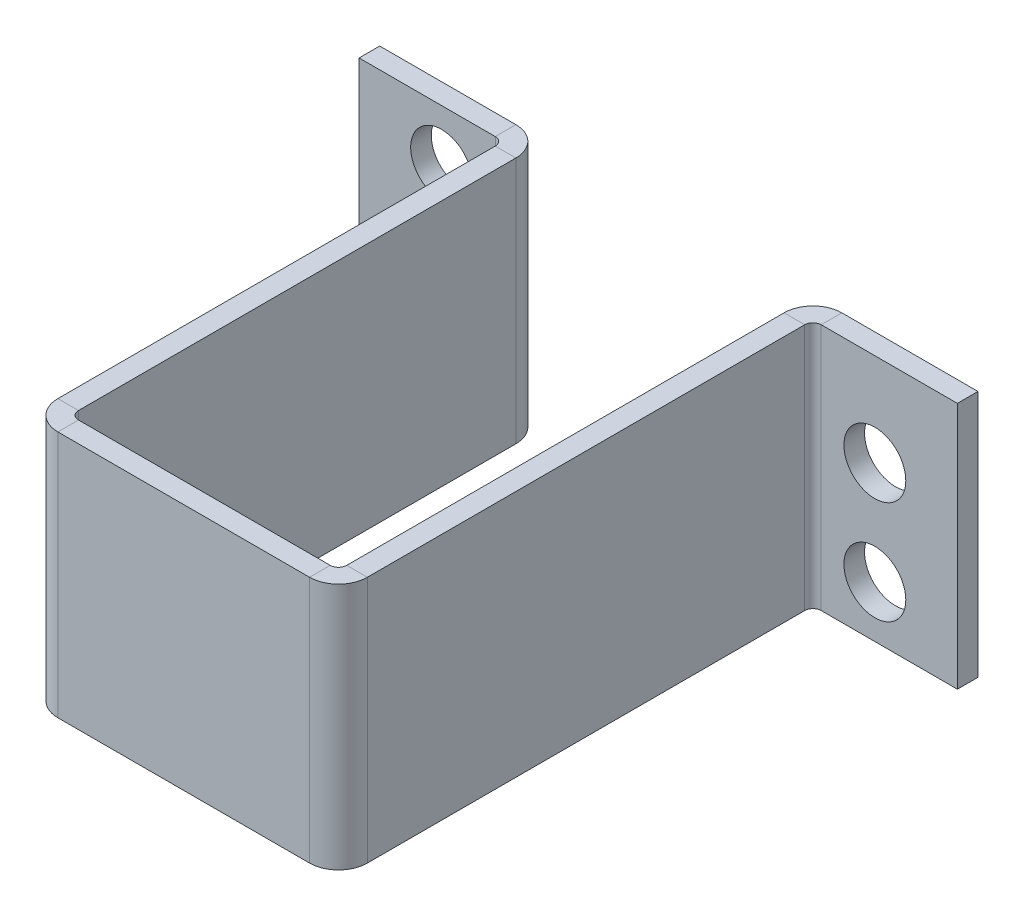
ISO-10303-21;
HEADER;
FILE_DESCRIPTION(('STEP AP214'),'2;1');
FILE_NAME('part.step','',(''),(''),'','','');
FILE_SCHEMA(('AUTOMOTIVE_DESIGN { 1 0 10303 214 1 1 1 1 }'));
ENDSEC;
DATA;
#1=APPLICATION_CONTEXT('core data for automotive mechanical design processes');
#2=APPLICATION_PROTOCOL_DEFINITION('international standard','automotive_design',2000,#1);
#3=PRODUCT_CONTEXT('',#1,'mechanical');
#4=PRODUCT('Part','Part','',(#3));
#5=PRODUCT_RELATED_PRODUCT_CATEGORY('part','',(#4));
#6=PRODUCT_DEFINITION_FORMATION('','',#4);
#7=PRODUCT_DEFINITION_CONTEXT('part definition',#1,'design');
#8=PRODUCT_DEFINITION('design','',#6,#7);
#9=PRODUCT_DEFINITION_SHAPE('','',#8);
#10=(LENGTH_UNIT() NAMED_UNIT(*) SI_UNIT(.MILLI.,.METRE.));
#11=(NAMED_UNIT(*) PLANE_ANGLE_UNIT() SI_UNIT($,.RADIAN.));
#12=(NAMED_UNIT(*) SI_UNIT($,.STERADIAN.) SOLID_ANGLE_UNIT());
#13=UNCERTAINTY_MEASURE_WITH_UNIT(LENGTH_MEASURE(1.E-05),#10,'distance_accuracy_value','');
#14=(GEOMETRIC_REPRESENTATION_CONTEXT(3) GLOBAL_UNCERTAINTY_ASSIGNED_CONTEXT((#13)) GLOBAL_UNIT_ASSIGNED_CONTEXT((#10,
#11,#12)) REPRESENTATION_CONTEXT('',''));
#15=CARTESIAN_POINT('',(0.,0.,0.));
#16=DIRECTION('',(0.,0.,1.));
#17=DIRECTION('',(1.,0.,0.));
#18=AXIS2_PLACEMENT_3D('',#15,#16,#17);
#19=CARTESIAN_POINT('',(3.75000000000004,-3.,-11.5));
#20=DIRECTION('',(0.,1.,0.));
#21=DIRECTION('',(-1.,0.,0.));
#22=AXIS2_PLACEMENT_3D('',#19,#20,#21);
#23=PLANE('',#22);
#24=DIRECTION('',(-1.,0.,0.));
#25=VECTOR('',#24,1.);
#26=CARTESIAN_POINT('',(3.75000000000004,-3.,-11.3));
#27=LINE('',#26,#25);
#28=CARTESIAN_POINT('',(3.75000000000004,-3.,-11.3));
#29=VERTEX_POINT('',#28);
#30=CARTESIAN_POINT('',(3.25000000000004,-3.,-11.3));
#31=VERTEX_POINT('',#30);
#32=EDGE_CURVE('E234',#29,#31,#27,.T.);
#33=ORIENTED_EDGE('',*,*,#32,.F.);
#34=DIRECTION('',(0.,0.,-1.));
#35=VECTOR('',#34,1.);
#36=CARTESIAN_POINT('',(3.75000000000004,-3.,-11.5));
#37=LINE('',#36,#35);
#38=CARTESIAN_POINT('',(3.75,-3.,-0.699999999999998));
#39=VERTEX_POINT('',#38);
#40=EDGE_CURVE('E299',#39,#29,#37,.T.);
#41=ORIENTED_EDGE('',*,*,#40,.F.);
#42=DIRECTION('',(1.,0.,0.));
#43=VECTOR('',#42,1.);
#44=CARTESIAN_POINT('',(3.25,-3.,-0.699999999999999));
#45=LINE('',#44,#43);
#46=CARTESIAN_POINT('',(3.25,-3.,-0.699999999999999));
#47=VERTEX_POINT('',#46);
#48=EDGE_CURVE('E290',#47,#39,#45,.T.);
#49=ORIENTED_EDGE('',*,*,#48,.F.);
#50=DIRECTION('',(0.,0.,-1.));
#51=VECTOR('',#50,1.);
#52=CARTESIAN_POINT('',(3.25000000000004,-3.,-11.5));
#53=LINE('',#52,#51);
#54=EDGE_CURVE('E298',#47,#31,#53,.T.);
#55=ORIENTED_EDGE('',*,*,#54,.T.);
#56=EDGE_LOOP('',(#33,#41,#49,#55));
#57=FACE_BOUND('',#56,.T.);
#58=ADVANCED_FACE('F39',(#57),#23,.F.);
#59=CARTESIAN_POINT('',(3.75,3.,-0.499999999999998));
#60=DIRECTION('',(0.,-1.,0.));
#61=DIRECTION('',(1.,0.,0.));
#62=AXIS2_PLACEMENT_3D('',#59,#60,#61);
#63=PLANE('',#62);
#64=DIRECTION('',(-1.,0.,0.));
#65=VECTOR('',#64,1.);
#66=CARTESIAN_POINT('',(3.75000000000004,3.,-11.3));
#67=LINE('',#66,#65);
#68=CARTESIAN_POINT('',(3.75000000000004,3.,-11.3));
#69=VERTEX_POINT('',#68);
#70=CARTESIAN_POINT('',(3.25000000000004,3.,-11.3));
#71=VERTEX_POINT('',#70);
#72=EDGE_CURVE('E227',#69,#71,#67,.T.);
#73=ORIENTED_EDGE('',*,*,#72,.T.);
#74=DIRECTION('',(0.,0.,1.));
#75=VECTOR('',#74,1.);
#76=CARTESIAN_POINT('',(3.25,3.,-0.5));
#77=LINE('',#76,#75);
#78=CARTESIAN_POINT('',(3.25,3.,-0.699999999999999));
#79=VERTEX_POINT('',#78);
#80=EDGE_CURVE('E303',#71,#79,#77,.T.);
#81=ORIENTED_EDGE('',*,*,#80,.T.);
#82=DIRECTION('',(1.,0.,0.));
#83=VECTOR('',#82,1.);
#84=CARTESIAN_POINT('',(3.25,3.,-0.699999999999999));
#85=LINE('',#84,#83);
#86=CARTESIAN_POINT('',(3.75,3.,-0.699999999999998));
#87=VERTEX_POINT('',#86);
#88=EDGE_CURVE('E285',#79,#87,#85,.T.);
#89=ORIENTED_EDGE('',*,*,#88,.T.);
#90=DIRECTION('',(0.,0.,1.));
#91=VECTOR('',#90,1.);
#92=CARTESIAN_POINT('',(3.75,3.,-0.499999999999998));
#93=LINE('',#92,#91);
#94=EDGE_CURVE('E302',#69,#87,#93,.T.);
#95=ORIENTED_EDGE('',*,*,#94,.F.);
#96=EDGE_LOOP('',(#73,#81,#89,#95));
#97=FACE_BOUND('',#96,.T.);
#98=ADVANCED_FACE('F460',(#97),#63,.F.);
#99=CARTESIAN_POINT('',(3.75,0.,0.));
#100=DIRECTION('',(-1.,0.,0.));
#101=DIRECTION('',(0.,0.,1.));
#102=AXIS2_PLACEMENT_3D('',#99,#100,#101);
#103=PLANE('',#102);
#104=DIRECTION('',(0.,1.,0.));
#105=VECTOR('',#104,1.);
#106=CARTESIAN_POINT('',(3.75000000000004,3.,-11.3));
#107=LINE('',#106,#105);
#108=EDGE_CURVE('E231',#69,#29,#107,.F.);
#109=ORIENTED_EDGE('',*,*,#108,.F.);
#110=ORIENTED_EDGE('',*,*,#94,.T.);
#111=DIRECTION('',(0.,1.,0.));
#112=VECTOR('',#111,1.);
#113=CARTESIAN_POINT('',(3.75,0.,-0.699999999999998));
#114=LINE('',#113,#112);
#115=EDGE_CURVE('E293',#39,#87,#114,.T.);
#116=ORIENTED_EDGE('',*,*,#115,.F.);
#117=ORIENTED_EDGE('',*,*,#40,.T.);
#118=EDGE_LOOP('',(#109,#110,#116,#117));
#119=FACE_BOUND('',#118,.T.);
#120=ADVANCED_FACE('F466',(#119),#103,.F.);
#121=CARTESIAN_POINT('',(3.25,0.,0.));
#122=DIRECTION('',(-1.,0.,0.));
#123=DIRECTION('',(0.,0.,1.));
#124=AXIS2_PLACEMENT_3D('',#121,#122,#123);
#125=PLANE('',#124);
#126=ORIENTED_EDGE('',*,*,#80,.F.);
#127=DIRECTION('',(0.,1.,0.));
#128=VECTOR('',#127,1.);
#129=CARTESIAN_POINT('',(3.25000000000004,3.,-11.3));
#130=LINE('',#129,#128);
#131=EDGE_CURVE('E182',#71,#31,#130,.F.);
#132=ORIENTED_EDGE('',*,*,#131,.T.);
#133=ORIENTED_EDGE('',*,*,#54,.F.);
#134=DIRECTION('',(0.,-1.,0.));
#135=VECTOR('',#134,1.);
#136=CARTESIAN_POINT('',(3.25,3.,-0.699999999999999));
#137=LINE('',#136,#135);
#138=EDGE_CURVE('E288',#79,#47,#137,.T.);
#139=ORIENTED_EDGE('',*,*,#138,.F.);
#140=EDGE_LOOP('',(#126,#132,#133,#139));
#141=FACE_BOUND('',#140,.T.);
#142=ADVANCED_FACE('F492',(#141),#125,.T.);
#143=CARTESIAN_POINT('',(-3.75000000000004,3.,-11.5));
#144=DIRECTION('',(0.,-1.,0.));
#145=DIRECTION('',(0.,0.,-1.));
#146=AXIS2_PLACEMENT_3D('',#143,#144,#145);
#147=PLANE('',#146);
#148=DIRECTION('',(1.,0.,0.));
#149=VECTOR('',#148,1.);
#150=CARTESIAN_POINT('',(-3.75000000000004,3.,-11.3));
#151=LINE('',#150,#149);
#152=CARTESIAN_POINT('',(-3.75000000000004,3.,-11.3));
#153=VERTEX_POINT('',#152);
#154=CARTESIAN_POINT('',(-3.25000000000004,3.,-11.3));
#155=VERTEX_POINT('',#154);
#156=EDGE_CURVE('E283',#153,#155,#151,.T.);
#157=ORIENTED_EDGE('',*,*,#156,.F.);
#158=DIRECTION('',(0.,0.,-1.));
#159=VECTOR('',#158,1.);
#160=CARTESIAN_POINT('',(-3.75000000000004,3.,-11.5));
#161=LINE('',#160,#159);
#162=CARTESIAN_POINT('',(-3.75,3.,-0.699999999999997));
#163=VERTEX_POINT('',#162);
#164=EDGE_CURVE('E343',#163,#153,#161,.T.);
#165=ORIENTED_EDGE('',*,*,#164,.F.);
#166=DIRECTION('',(-1.,0.,0.));
#167=VECTOR('',#166,1.);
#168=CARTESIAN_POINT('',(-3.25,3.,-0.699999999999999));
#169=LINE('',#168,#167);
#170=CARTESIAN_POINT('',(-3.25,3.,-0.699999999999999));
#171=VERTEX_POINT('',#170);
#172=EDGE_CURVE('E334',#171,#163,#169,.T.);
#173=ORIENTED_EDGE('',*,*,#172,.F.);
#174=DIRECTION('',(0.,0.,-1.));
#175=VECTOR('',#174,1.);
#176=CARTESIAN_POINT('',(-3.25000000000004,3.,-11.5));
#177=LINE('',#176,#175);
#178=EDGE_CURVE('E342',#171,#155,#177,.T.);
#179=ORIENTED_EDGE('',*,*,#178,.T.);
#180=EDGE_LOOP('',(#157,#165,#173,#179));
#181=FACE_BOUND('',#180,.T.);
#182=ADVANCED_FACE('F402',(#181),#147,.F.);
#183=CARTESIAN_POINT('',(-3.75,-3.,-0.499999999999998));
#184=DIRECTION('',(0.,1.,0.));
#185=DIRECTION('',(0.,0.,1.));
#186=AXIS2_PLACEMENT_3D('',#183,#184,#185);
#187=PLANE('',#186);
#188=DIRECTION('',(1.,0.,0.));
#189=VECTOR('',#188,1.);
#190=CARTESIAN_POINT('',(-3.75000000000004,-3.,-11.3));
#191=LINE('',#190,#189);
#192=CARTESIAN_POINT('',(-3.75000000000004,-3.,-11.3));
#193=VERTEX_POINT('',#192);
#194=CARTESIAN_POINT('',(-3.25000000000004,-3.,-11.3));
#195=VERTEX_POINT('',#194);
#196=EDGE_CURVE('E273',#193,#195,#191,.T.);
#197=ORIENTED_EDGE('',*,*,#196,.T.);
#198=DIRECTION('',(0.,0.,1.));
#199=VECTOR('',#198,1.);
#200=CARTESIAN_POINT('',(-3.25,-3.,-0.5));
#201=LINE('',#200,#199);
#202=CARTESIAN_POINT('',(-3.25,-3.,-0.699999999999999));
#203=VERTEX_POINT('',#202);
#204=EDGE_CURVE('E347',#195,#203,#201,.T.);
#205=ORIENTED_EDGE('',*,*,#204,.T.);
#206=DIRECTION('',(-1.,0.,0.));
#207=VECTOR('',#206,1.);
#208=CARTESIAN_POINT('',(-3.25,-3.,-0.699999999999999));
#209=LINE('',#208,#207);
#210=CARTESIAN_POINT('',(-3.75,-3.,-0.699999999999998));
#211=VERTEX_POINT('',#210);
#212=EDGE_CURVE('E329',#203,#211,#209,.T.);
#213=ORIENTED_EDGE('',*,*,#212,.T.);
#214=DIRECTION('',(0.,0.,1.));
#215=VECTOR('',#214,1.);
#216=CARTESIAN_POINT('',(-3.75,-3.,-0.499999999999998));
#217=LINE('',#216,#215);
#218=EDGE_CURVE('E346',#193,#211,#217,.T.);
#219=ORIENTED_EDGE('',*,*,#218,.F.);
#220=EDGE_LOOP('',(#197,#205,#213,#219));
#221=FACE_BOUND('',#220,.T.);
#222=ADVANCED_FACE('F416',(#221),#187,.F.);
#223=CARTESIAN_POINT('',(-3.75,0.,0.));
#224=DIRECTION('',(1.,0.,0.));
#225=DIRECTION('',(0.,0.,-1.));
#226=AXIS2_PLACEMENT_3D('',#223,#224,#225);
#227=PLANE('',#226);
#228=DIRECTION('',(0.,-1.,0.));
#229=VECTOR('',#228,1.);
#230=CARTESIAN_POINT('',(-3.75000000000004,-3.,-11.3));
#231=LINE('',#230,#229);
#232=EDGE_CURVE('E279',#193,#153,#231,.F.);
#233=ORIENTED_EDGE('',*,*,#232,.F.);
#234=ORIENTED_EDGE('',*,*,#218,.T.);
#235=DIRECTION('',(0.,-1.,0.));
#236=VECTOR('',#235,1.);
#237=CARTESIAN_POINT('',(-3.75,0.,-0.699999999999997));
#238=LINE('',#237,#236);
#239=EDGE_CURVE('E337',#163,#211,#238,.T.);
#240=ORIENTED_EDGE('',*,*,#239,.F.);
#241=ORIENTED_EDGE('',*,*,#164,.T.);
#242=EDGE_LOOP('',(#233,#234,#240,#241));
#243=FACE_BOUND('',#242,.T.);
#244=ADVANCED_FACE('F407',(#243),#227,.F.);
#245=CARTESIAN_POINT('',(-3.25,0.,0.));
#246=DIRECTION('',(1.,0.,0.));
#247=DIRECTION('',(0.,0.,-1.));
#248=AXIS2_PLACEMENT_3D('',#245,#246,#247);
#249=PLANE('',#248);
#250=ORIENTED_EDGE('',*,*,#204,.F.);
#251=DIRECTION('',(0.,-1.,0.));
#252=VECTOR('',#251,1.);
#253=CARTESIAN_POINT('',(-3.25000000000004,-3.,-11.3));
#254=LINE('',#253,#252);
#255=EDGE_CURVE('E268',#195,#155,#254,.F.);
#256=ORIENTED_EDGE('',*,*,#255,.T.);
#257=ORIENTED_EDGE('',*,*,#178,.F.);
#258=DIRECTION('',(0.,1.,0.));
#259=VECTOR('',#258,1.);
#260=CARTESIAN_POINT('',(-3.25,-3.,-0.699999999999999));
#261=LINE('',#260,#259);
#262=EDGE_CURVE('E332',#203,#171,#261,.T.);
#263=ORIENTED_EDGE('',*,*,#262,.F.);
#264=EDGE_LOOP('',(#250,#256,#257,#263));
#265=FACE_BOUND('',#264,.T.);
#266=ADVANCED_FACE('F399',(#265),#249,.T.);
#267=CARTESIAN_POINT('',(0.,0.,-0.5));
#268=DIRECTION('',(0.,0.,1.));
#269=DIRECTION('',(1.,0.,0.));
#270=AXIS2_PLACEMENT_3D('',#267,#268,#269);
#271=PLANE('',#270);
#272=DIRECTION('',(0.,-1.,0.));
#273=VECTOR('',#272,1.);
#274=CARTESIAN_POINT('',(3.05,-3.,-0.5));
#275=LINE('',#274,#273);
#276=CARTESIAN_POINT('',(3.05,-3.,-0.5));
#277=VERTEX_POINT('',#276);
#278=CARTESIAN_POINT('',(3.05,3.,-0.5));
#279=VERTEX_POINT('',#278);
#280=EDGE_CURVE('E322',#277,#279,#275,.F.);
#281=ORIENTED_EDGE('',*,*,#280,.F.);
#282=DIRECTION('',(1.,0.,0.));
#283=VECTOR('',#282,1.);
#284=CARTESIAN_POINT('',(3.25,-3.,-0.5));
#285=LINE('',#284,#283);
#286=CARTESIAN_POINT('',(-3.05,-3.,-0.5));
#287=VERTEX_POINT('',#286);
#288=EDGE_CURVE('E48',#287,#277,#285,.T.);
#289=ORIENTED_EDGE('',*,*,#288,.F.);
#290=DIRECTION('',(0.,1.,0.));
#291=VECTOR('',#290,1.);
#292=CARTESIAN_POINT('',(-3.05,3.,-0.5));
#293=LINE('',#292,#291);
#294=CARTESIAN_POINT('',(-3.05,3.,-0.5));
#295=VERTEX_POINT('',#294);
#296=EDGE_CURVE('E366',#295,#287,#293,.F.);
#297=ORIENTED_EDGE('',*,*,#296,.F.);
#298=DIRECTION('',(-1.,0.,0.));
#299=VECTOR('',#298,1.);
#300=CARTESIAN_POINT('',(3.25,3.,-0.5));
#301=LINE('',#300,#299);
#302=EDGE_CURVE('E11',#279,#295,#301,.T.);
#303=ORIENTED_EDGE('',*,*,#302,.F.);
#304=EDGE_LOOP('',(#281,#289,#297,#303));
#305=FACE_BOUND('',#304,.T.);
#306=ADVANCED_FACE('F487',(#305),#271,.F.);
#307=CARTESIAN_POINT('',(0.,0.,0.));
#308=DIRECTION('',(0.,0.,1.));
#309=DIRECTION('',(1.,0.,0.));
#310=AXIS2_PLACEMENT_3D('',#307,#308,#309);
#311=PLANE('',#310);
#312=DIRECTION('',(1.,0.,0.));
#313=VECTOR('',#312,1.);
#314=CARTESIAN_POINT('',(3.25,-3.,0.));
#315=LINE('',#314,#313);
#316=CARTESIAN_POINT('',(-3.05,-3.,0.));
#317=VERTEX_POINT('',#316);
#318=CARTESIAN_POINT('',(3.05,-3.,0.));
#319=VERTEX_POINT('',#318);
#320=EDGE_CURVE('E373',#317,#319,#315,.T.);
#321=ORIENTED_EDGE('',*,*,#320,.T.);
#322=DIRECTION('',(0.,-1.,0.));
#323=VECTOR('',#322,1.);
#324=CARTESIAN_POINT('',(3.05,-3.,0.));
#325=LINE('',#324,#323);
#326=CARTESIAN_POINT('',(3.05,3.,0.));
#327=VERTEX_POINT('',#326);
#328=EDGE_CURVE('E309',#319,#327,#325,.F.);
#329=ORIENTED_EDGE('',*,*,#328,.T.);
#330=DIRECTION('',(-1.,0.,0.));
#331=VECTOR('',#330,1.);
#332=CARTESIAN_POINT('',(3.25,3.,0.));
#333=LINE('',#332,#331);
#334=CARTESIAN_POINT('',(-3.05,3.,0.));
#335=VERTEX_POINT('',#334);
#336=EDGE_CURVE('E43',#327,#335,#333,.T.);
#337=ORIENTED_EDGE('',*,*,#336,.T.);
#338=DIRECTION('',(0.,1.,0.));
#339=VECTOR('',#338,1.);
#340=CARTESIAN_POINT('',(-3.05,3.,0.));
#341=LINE('',#340,#339);
#342=EDGE_CURVE('E353',#335,#317,#341,.F.);
#343=ORIENTED_EDGE('',*,*,#342,.T.);
#344=EDGE_LOOP('',(#321,#329,#337,#343));
#345=FACE_BOUND('',#344,.T.);
#346=ADVANCED_FACE('F382',(#345),#311,.T.);
#347=CARTESIAN_POINT('',(3.25,-3.,-0.5));
#348=DIRECTION('',(0.,-1.,0.));
#349=DIRECTION('',(1.,0.,0.));
#350=AXIS2_PLACEMENT_3D('',#347,#348,#349);
#351=PLANE('',#350);
#352=ORIENTED_EDGE('',*,*,#288,.T.);
#353=DIRECTION('',(0.,0.,1.));
#354=VECTOR('',#353,1.);
#355=CARTESIAN_POINT('',(3.05,-3.,-0.5));
#356=LINE('',#355,#354);
#357=EDGE_CURVE('E316',#277,#319,#356,.T.);
#358=ORIENTED_EDGE('',*,*,#357,.T.);
#359=ORIENTED_EDGE('',*,*,#320,.F.);
#360=DIRECTION('',(0.,0.,1.));
#361=VECTOR('',#360,1.);
#362=CARTESIAN_POINT('',(-3.05,-3.,-0.5));
#363=LINE('',#362,#361);
#364=EDGE_CURVE('E370',#287,#317,#363,.T.);
#365=ORIENTED_EDGE('',*,*,#364,.F.);
#366=EDGE_LOOP('',(#352,#358,#359,#365));
#367=FACE_BOUND('',#366,.T.);
#368=ADVANCED_FACE('F41',(#367),#351,.T.);
#369=CARTESIAN_POINT('',(3.25,3.,-0.5));
#370=DIRECTION('',(0.,1.,0.));
#371=DIRECTION('',(-1.,0.,0.));
#372=AXIS2_PLACEMENT_3D('',#369,#370,#371);
#373=PLANE('',#372);
#374=DIRECTION('',(0.,0.,1.));
#375=VECTOR('',#374,1.);
#376=CARTESIAN_POINT('',(3.05,3.,-0.5));
#377=LINE('',#376,#375);
#378=EDGE_CURVE('E326',#279,#327,#377,.T.);
#379=ORIENTED_EDGE('',*,*,#378,.F.);
#380=ORIENTED_EDGE('',*,*,#302,.T.);
#381=DIRECTION('',(0.,0.,1.));
#382=VECTOR('',#381,1.);
#383=CARTESIAN_POINT('',(-3.05,3.,-0.5));
#384=LINE('',#383,#382);
#385=EDGE_CURVE('E360',#295,#335,#384,.T.);
#386=ORIENTED_EDGE('',*,*,#385,.T.);
#387=ORIENTED_EDGE('',*,*,#336,.F.);
#388=EDGE_LOOP('',(#379,#380,#386,#387));
#389=FACE_BOUND('',#388,.T.);
#390=ADVANCED_FACE('F385',(#389),#373,.T.);
#391=CARTESIAN_POINT('',(-3.05,-3.,-0.7));
#392=DIRECTION('',(0.,-1.,0.));
#393=DIRECTION('',(0.,0.,-1.));
#394=AXIS2_PLACEMENT_3D('',#391,#392,#393);
#395=PLANE('',#394);
#396=ORIENTED_EDGE('',*,*,#212,.F.);
#397=CARTESIAN_POINT('',(-3.05,-3.,-0.7));
#398=DIRECTION('',(0.,1.,0.));
#399=DIRECTION('',(0.,0.,1.));
#400=AXIS2_PLACEMENT_3D('',#397,#398,#399);
#401=CIRCLE('',#400,0.2);
#402=EDGE_CURVE('E363',#287,#203,#401,.F.);
#403=ORIENTED_EDGE('',*,*,#402,.F.);
#404=ORIENTED_EDGE('',*,*,#364,.T.);
#405=CARTESIAN_POINT('',(-3.05,-3.,-0.7));
#406=DIRECTION('',(0.,1.,0.));
#407=DIRECTION('',(0.,0.,1.));
#408=AXIS2_PLACEMENT_3D('',#405,#406,#407);
#409=CIRCLE('',#408,0.7);
#410=EDGE_CURVE('E356',#317,#211,#409,.F.);
#411=ORIENTED_EDGE('',*,*,#410,.T.);
#412=EDGE_LOOP('',(#396,#403,#404,#411));
#413=FACE_BOUND('',#412,.T.);
#414=ADVANCED_FACE('F413',(#413),#395,.T.);
#415=CARTESIAN_POINT('',(-3.05,3.,-0.7));
#416=DIRECTION('',(0.,-1.,0.));
#417=DIRECTION('',(0.,0.,-1.));
#418=AXIS2_PLACEMENT_3D('',#415,#416,#417);
#419=PLANE('',#418);
#420=CARTESIAN_POINT('',(-3.05,3.,-0.7));
#421=DIRECTION('',(0.,1.,0.));
#422=DIRECTION('',(0.,0.,1.));
#423=AXIS2_PLACEMENT_3D('',#420,#421,#422);
#424=CIRCLE('',#423,0.2);
#425=EDGE_CURVE('E349',#171,#295,#424,.T.);
#426=ORIENTED_EDGE('',*,*,#425,.F.);
#427=ORIENTED_EDGE('',*,*,#172,.T.);
#428=CARTESIAN_POINT('',(-3.05,3.,-0.7));
#429=DIRECTION('',(0.,1.,0.));
#430=DIRECTION('',(0.,0.,1.));
#431=AXIS2_PLACEMENT_3D('',#428,#429,#430);
#432=CIRCLE('',#431,0.7);
#433=EDGE_CURVE('E357',#163,#335,#432,.T.);
#434=ORIENTED_EDGE('',*,*,#433,.T.);
#435=ORIENTED_EDGE('',*,*,#385,.F.);
#436=EDGE_LOOP('',(#426,#427,#434,#435));
#437=FACE_BOUND('',#436,.T.);
#438=ADVANCED_FACE('F390',(#437),#419,.F.);
#439=CARTESIAN_POINT('',(-3.05,3.,-0.7));
#440=DIRECTION('',(0.,1.,0.));
#441=DIRECTION('',(-1.,0.,0.));
#442=AXIS2_PLACEMENT_3D('',#439,#440,#441);
#443=CYLINDRICAL_SURFACE('',#442,0.7);
#444=ORIENTED_EDGE('',*,*,#342,.F.);
#445=ORIENTED_EDGE('',*,*,#433,.F.);
#446=ORIENTED_EDGE('',*,*,#239,.T.);
#447=ORIENTED_EDGE('',*,*,#410,.F.);
#448=EDGE_LOOP('',(#444,#445,#446,#447));
#449=FACE_BOUND('',#448,.T.);
#450=ADVANCED_FACE('F410',(#449),#443,.T.);
#451=CARTESIAN_POINT('',(-3.05,3.,-0.7));
#452=DIRECTION('',(0.,1.,0.));
#453=DIRECTION('',(-1.,0.,0.));
#454=AXIS2_PLACEMENT_3D('',#451,#452,#453);
#455=CYLINDRICAL_SURFACE('',#454,0.2);
#456=ORIENTED_EDGE('',*,*,#296,.T.);
#457=ORIENTED_EDGE('',*,*,#402,.T.);
#458=ORIENTED_EDGE('',*,*,#262,.T.);
#459=ORIENTED_EDGE('',*,*,#425,.T.);
#460=EDGE_LOOP('',(#456,#457,#458,#459));
#461=FACE_BOUND('',#460,.T.);
#462=ADVANCED_FACE('F393',(#461),#455,.F.);
#463=CARTESIAN_POINT('',(3.05,3.,-0.7));
#464=DIRECTION('',(0.,1.,0.));
#465=DIRECTION('',(0.,0.,1.));
#466=AXIS2_PLACEMENT_3D('',#463,#464,#465);
#467=PLANE('',#466);
#468=ORIENTED_EDGE('',*,*,#88,.F.);
#469=CARTESIAN_POINT('',(3.05,3.,-0.7));
#470=DIRECTION('',(0.,-1.,0.));
#471=DIRECTION('',(0.,0.,-1.));
#472=AXIS2_PLACEMENT_3D('',#469,#470,#471);
#473=CIRCLE('',#472,0.2);
#474=EDGE_CURVE('E319',#279,#79,#473,.F.);
#475=ORIENTED_EDGE('',*,*,#474,.F.);
#476=ORIENTED_EDGE('',*,*,#378,.T.);
#477=CARTESIAN_POINT('',(3.05,3.,-0.7));
#478=DIRECTION('',(0.,-1.,0.));
#479=DIRECTION('',(0.,0.,-1.));
#480=AXIS2_PLACEMENT_3D('',#477,#478,#479);
#481=CIRCLE('',#480,0.7);
#482=EDGE_CURVE('E312',#327,#87,#481,.F.);
#483=ORIENTED_EDGE('',*,*,#482,.T.);
#484=EDGE_LOOP('',(#468,#475,#476,#483));
#485=FACE_BOUND('',#484,.T.);
#486=ADVANCED_FACE('F476',(#485),#467,.T.);
#487=CARTESIAN_POINT('',(3.05,-3.,-0.7));
#488=DIRECTION('',(0.,1.,0.));
#489=DIRECTION('',(0.,0.,1.));
#490=AXIS2_PLACEMENT_3D('',#487,#488,#489);
#491=PLANE('',#490);
#492=CARTESIAN_POINT('',(3.05,-3.,-0.7));
#493=DIRECTION('',(0.,-1.,0.));
#494=DIRECTION('',(0.,0.,-1.));
#495=AXIS2_PLACEMENT_3D('',#492,#493,#494);
#496=CIRCLE('',#495,0.2);
#497=EDGE_CURVE('E305',#47,#277,#496,.T.);
#498=ORIENTED_EDGE('',*,*,#497,.F.);
#499=ORIENTED_EDGE('',*,*,#48,.T.);
#500=CARTESIAN_POINT('',(3.05,-3.,-0.7));
#501=DIRECTION('',(0.,-1.,0.));
#502=DIRECTION('',(0.,0.,-1.));
#503=AXIS2_PLACEMENT_3D('',#500,#501,#502);
#504=CIRCLE('',#503,0.7);
#505=EDGE_CURVE('E313',#39,#319,#504,.T.);
#506=ORIENTED_EDGE('',*,*,#505,.T.);
#507=ORIENTED_EDGE('',*,*,#357,.F.);
#508=EDGE_LOOP('',(#498,#499,#506,#507));
#509=FACE_BOUND('',#508,.T.);
#510=ADVANCED_FACE('F473',(#509),#491,.F.);
#511=CARTESIAN_POINT('',(3.05,-3.,-0.7));
#512=DIRECTION('',(0.,-1.,0.));
#513=DIRECTION('',(1.,0.,0.));
#514=AXIS2_PLACEMENT_3D('',#511,#512,#513);
#515=CYLINDRICAL_SURFACE('',#514,0.7);
#516=ORIENTED_EDGE('',*,*,#328,.F.);
#517=ORIENTED_EDGE('',*,*,#505,.F.);
#518=ORIENTED_EDGE('',*,*,#115,.T.);
#519=ORIENTED_EDGE('',*,*,#482,.F.);
#520=EDGE_LOOP('',(#516,#517,#518,#519));
#521=FACE_BOUND('',#520,.T.);
#522=ADVANCED_FACE('F455',(#521),#515,.T.);
#523=CARTESIAN_POINT('',(3.05,-3.,-0.7));
#524=DIRECTION('',(0.,-1.,0.));
#525=DIRECTION('',(1.,0.,0.));
#526=AXIS2_PLACEMENT_3D('',#523,#524,#525);
#527=CYLINDRICAL_SURFACE('',#526,0.2);
#528=ORIENTED_EDGE('',*,*,#280,.T.);
#529=ORIENTED_EDGE('',*,*,#474,.T.);
#530=ORIENTED_EDGE('',*,*,#138,.T.);
#531=ORIENTED_EDGE('',*,*,#497,.T.);
#532=EDGE_LOOP('',(#528,#529,#530,#531));
#533=FACE_BOUND('',#532,.T.);
#534=ADVANCED_FACE('F448',(#533),#527,.F.);
#535=CARTESIAN_POINT('',(-3.95000000000004,3.,-11.3));
#536=DIRECTION('',(0.,1.,0.));
#537=DIRECTION('',(0.,0.,1.));
#538=AXIS2_PLACEMENT_3D('',#535,#536,#537);
#539=PLANE('',#538);
#540=DIRECTION('',(0.,0.,-1.));
#541=VECTOR('',#540,1.);
#542=CARTESIAN_POINT('',(-3.95000000000004,3.,-11.5));
#543=LINE('',#542,#541);
#544=CARTESIAN_POINT('',(-3.95000000000004,3.,-11.5));
#545=VERTEX_POINT('',#544);
#546=CARTESIAN_POINT('',(-3.95000000000004,3.,-12.));
#547=VERTEX_POINT('',#546);
#548=EDGE_CURVE('E236',#545,#547,#543,.T.);
#549=ORIENTED_EDGE('',*,*,#548,.F.);
#550=CARTESIAN_POINT('',(-3.95000000000004,3.,-11.3));
#551=DIRECTION('',(0.,-1.,0.));
#552=DIRECTION('',(0.,0.,-1.));
#553=AXIS2_PLACEMENT_3D('',#550,#551,#552);
#554=CIRCLE('',#553,0.199999999999999);
#555=EDGE_CURVE('E276',#153,#545,#554,.F.);
#556=ORIENTED_EDGE('',*,*,#555,.F.);
#557=ORIENTED_EDGE('',*,*,#156,.T.);
#558=CARTESIAN_POINT('',(-3.95000000000004,3.,-11.3));
#559=DIRECTION('',(0.,-1.,0.));
#560=DIRECTION('',(0.,0.,-1.));
#561=AXIS2_PLACEMENT_3D('',#558,#559,#560);
#562=CIRCLE('',#561,0.699999999999999);
#563=EDGE_CURVE('E64',#155,#547,#562,.F.);
#564=ORIENTED_EDGE('',*,*,#563,.T.);
#565=EDGE_LOOP('',(#549,#556,#557,#564));
#566=FACE_BOUND('',#565,.T.);
#567=ADVANCED_FACE('F446',(#566),#539,.T.);
#568=CARTESIAN_POINT('',(-3.95000000000004,-3.,-11.3));
#569=DIRECTION('',(0.,1.,0.));
#570=DIRECTION('',(0.,0.,1.));
#571=AXIS2_PLACEMENT_3D('',#568,#569,#570);
#572=PLANE('',#571);
#573=CARTESIAN_POINT('',(-3.95000000000004,-3.,-11.3));
#574=DIRECTION('',(0.,-1.,0.));
#575=DIRECTION('',(0.,0.,-1.));
#576=AXIS2_PLACEMENT_3D('',#573,#574,#575);
#577=CIRCLE('',#576,0.199999999999999);
#578=CARTESIAN_POINT('',(-3.95000000000004,-3.,-11.5));
#579=VERTEX_POINT('',#578);
#580=EDGE_CURVE('E267',#579,#193,#577,.T.);
#581=ORIENTED_EDGE('',*,*,#580,.F.);
#582=DIRECTION('',(0.,0.,-1.));
#583=VECTOR('',#582,1.);
#584=CARTESIAN_POINT('',(-3.95000000000004,-3.,-11.5));
#585=LINE('',#584,#583);
#586=CARTESIAN_POINT('',(-3.95000000000004,-3.,-12.));
#587=VERTEX_POINT('',#586);
#588=EDGE_CURVE('E240',#579,#587,#585,.T.);
#589=ORIENTED_EDGE('',*,*,#588,.T.);
#590=CARTESIAN_POINT('',(-3.95000000000004,-3.,-11.3));
#591=DIRECTION('',(0.,-1.,0.));
#592=DIRECTION('',(0.,0.,-1.));
#593=AXIS2_PLACEMENT_3D('',#590,#591,#592);
#594=CIRCLE('',#593,0.699999999999999);
#595=EDGE_CURVE('E271',#587,#195,#594,.T.);
#596=ORIENTED_EDGE('',*,*,#595,.T.);
#597=ORIENTED_EDGE('',*,*,#196,.F.);
#598=EDGE_LOOP('',(#581,#589,#596,#597));
#599=FACE_BOUND('',#598,.T.);
#600=ADVANCED_FACE('F419',(#599),#572,.F.);
#601=CARTESIAN_POINT('',(-3.95000000000004,-3.,-11.3));
#602=DIRECTION('',(0.,-1.,0.));
#603=DIRECTION('',(0.,0.,-1.));
#604=AXIS2_PLACEMENT_3D('',#601,#602,#603);
#605=CYLINDRICAL_SURFACE('',#604,0.699999999999999);
#606=ORIENTED_EDGE('',*,*,#255,.F.);
#607=ORIENTED_EDGE('',*,*,#595,.F.);
#608=DIRECTION('',(0.,1.,0.));
#609=VECTOR('',#608,1.);
#610=CARTESIAN_POINT('',(-3.95000000000004,0.,-12.));
#611=LINE('',#610,#609);
#612=EDGE_CURVE('E243',#587,#547,#611,.T.);
#613=ORIENTED_EDGE('',*,*,#612,.T.);
#614=ORIENTED_EDGE('',*,*,#563,.F.);
#615=EDGE_LOOP('',(#606,#607,#613,#614));
#616=FACE_BOUND('',#615,.T.);
#617=ADVANCED_FACE('F444',(#616),#605,.T.);
#618=CARTESIAN_POINT('',(-3.95000000000004,-3.,-11.3));
#619=DIRECTION('',(0.,-1.,0.));
#620=DIRECTION('',(0.,0.,-1.));
#621=AXIS2_PLACEMENT_3D('',#618,#619,#620);
#622=CYLINDRICAL_SURFACE('',#621,0.199999999999999);
#623=ORIENTED_EDGE('',*,*,#232,.T.);
#624=ORIENTED_EDGE('',*,*,#555,.T.);
#625=DIRECTION('',(0.,-1.,0.));
#626=VECTOR('',#625,1.);
#627=CARTESIAN_POINT('',(-3.95000000000004,3.,-11.5));
#628=LINE('',#627,#626);
#629=EDGE_CURVE('E238',#545,#579,#628,.T.);
#630=ORIENTED_EDGE('',*,*,#629,.T.);
#631=ORIENTED_EDGE('',*,*,#580,.T.);
#632=EDGE_LOOP('',(#623,#624,#630,#631));
#633=FACE_BOUND('',#632,.T.);
#634=ADVANCED_FACE('F422',(#633),#622,.F.);
#635=CARTESIAN_POINT('',(-3.75000000000004,3.,-12.));
#636=DIRECTION('',(0.,-1.,0.));
#637=DIRECTION('',(0.,0.,-1.));
#638=AXIS2_PLACEMENT_3D('',#635,#636,#637);
#639=PLANE('',#638);
#640=ORIENTED_EDGE('',*,*,#548,.T.);
#641=DIRECTION('',(1.,0.,0.));
#642=VECTOR('',#641,1.);
#643=CARTESIAN_POINT('',(-3.75000000000004,3.,-12.));
#644=LINE('',#643,#642);
#645=CARTESIAN_POINT('',(-7.25000000000004,3.,-12.));
#646=VERTEX_POINT('',#645);
#647=EDGE_CURVE('E248',#646,#547,#644,.T.);
#648=ORIENTED_EDGE('',*,*,#647,.F.);
#649=DIRECTION('',(0.,0.,1.));
#650=VECTOR('',#649,1.);
#651=CARTESIAN_POINT('',(-7.25000000000004,3.,-12.));
#652=LINE('',#651,#650);
#653=CARTESIAN_POINT('',(-7.25000000000004,3.,-11.5));
#654=VERTEX_POINT('',#653);
#655=EDGE_CURVE('E256',#646,#654,#652,.T.);
#656=ORIENTED_EDGE('',*,*,#655,.T.);
#657=DIRECTION('',(1.,0.,0.));
#658=VECTOR('',#657,1.);
#659=CARTESIAN_POINT('',(-3.75000000000004,3.,-11.5));
#660=LINE('',#659,#658);
#661=EDGE_CURVE('E247',#654,#545,#660,.T.);
#662=ORIENTED_EDGE('',*,*,#661,.T.);
#663=EDGE_LOOP('',(#640,#648,#656,#662));
#664=FACE_BOUND('',#663,.T.);
#665=ADVANCED_FACE('F431',(#664),#639,.F.);
#666=CARTESIAN_POINT('',(-7.25000000000004,-3.,-12.));
#667=DIRECTION('',(0.,1.,0.));
#668=DIRECTION('',(0.,0.,1.));
#669=AXIS2_PLACEMENT_3D('',#666,#667,#668);
#670=PLANE('',#669);
#671=ORIENTED_EDGE('',*,*,#588,.F.);
#672=DIRECTION('',(-1.,0.,0.));
#673=VECTOR('',#672,1.);
#674=CARTESIAN_POINT('',(-7.25000000000004,-3.,-11.5));
#675=LINE('',#674,#673);
#676=CARTESIAN_POINT('',(-7.25000000000004,-3.,-11.5));
#677=VERTEX_POINT('',#676);
#678=EDGE_CURVE('E259',#579,#677,#675,.T.);
#679=ORIENTED_EDGE('',*,*,#678,.T.);
#680=DIRECTION('',(0.,0.,1.));
#681=VECTOR('',#680,1.);
#682=CARTESIAN_POINT('',(-7.25000000000004,-3.,-12.));
#683=LINE('',#682,#681);
#684=CARTESIAN_POINT('',(-7.25000000000004,-3.,-12.));
#685=VERTEX_POINT('',#684);
#686=EDGE_CURVE('E264',#685,#677,#683,.T.);
#687=ORIENTED_EDGE('',*,*,#686,.F.);
#688=DIRECTION('',(-1.,0.,0.));
#689=VECTOR('',#688,1.);
#690=CARTESIAN_POINT('',(-7.25000000000004,-3.,-12.));
#691=LINE('',#690,#689);
#692=EDGE_CURVE('E251',#587,#685,#691,.T.);
#693=ORIENTED_EDGE('',*,*,#692,.F.);
#694=EDGE_LOOP('',(#671,#679,#687,#693));
#695=FACE_BOUND('',#694,.T.);
#696=ADVANCED_FACE('F440',(#695),#670,.F.);
#697=CARTESIAN_POINT('',(0.,0.,-12.));
#698=DIRECTION('',(0.,0.,1.));
#699=DIRECTION('',(1.,0.,0.));
#700=AXIS2_PLACEMENT_3D('',#697,#698,#699);
#701=PLANE('',#700);
#702=CARTESIAN_POINT('',(-5.25000000000004,1.75,-12.));
#703=DIRECTION('',(0.,0.,1.));
#704=DIRECTION('',(1.,0.,0.));
#705=AXIS2_PLACEMENT_3D('',#702,#703,#704);
#706=CIRCLE('',#705,0.75);
#707=CARTESIAN_POINT('',(-4.50000000000004,1.75,-12.));
#708=VERTEX_POINT('',#707);
#709=EDGE_CURVE('E547',#708,#708,#706,.T.);
#710=ORIENTED_EDGE('',*,*,#709,.T.);
#711=EDGE_LOOP('',(#710));
#712=FACE_BOUND('',#711,.T.);
#713=CARTESIAN_POINT('',(-5.25000000000004,-0.749999999999999,-12.));
#714=DIRECTION('',(0.,0.,1.));
#715=DIRECTION('',(1.,0.,0.));
#716=AXIS2_PLACEMENT_3D('',#713,#714,#715);
#717=CIRCLE('',#716,0.749999999999999);
#718=CARTESIAN_POINT('',(-4.50000000000004,-0.749999999999999,-12.));
#719=VERTEX_POINT('',#718);
#720=EDGE_CURVE('E555',#719,#719,#717,.T.);
#721=ORIENTED_EDGE('',*,*,#720,.T.);
#722=EDGE_LOOP('',(#721));
#723=FACE_BOUND('',#722,.T.);
#724=ORIENTED_EDGE('',*,*,#612,.F.);
#725=ORIENTED_EDGE('',*,*,#692,.T.);
#726=DIRECTION('',(0.,1.,0.));
#727=VECTOR('',#726,1.);
#728=CARTESIAN_POINT('',(-7.25000000000004,3.,-12.));
#729=LINE('',#728,#727);
#730=EDGE_CURVE('E254',#685,#646,#729,.T.);
#731=ORIENTED_EDGE('',*,*,#730,.T.);
#732=ORIENTED_EDGE('',*,*,#647,.T.);
#733=EDGE_LOOP('',(#724,#725,#731,#732));
#734=FACE_BOUND('',#733,.T.);
#735=ADVANCED_FACE('F443',(#712,#723,#734),#701,.F.);
#736=CARTESIAN_POINT('',(0.,0.,-11.5));
#737=DIRECTION('',(0.,0.,1.));
#738=DIRECTION('',(1.,0.,0.));
#739=AXIS2_PLACEMENT_3D('',#736,#737,#738);
#740=PLANE('',#739);
#741=CARTESIAN_POINT('',(-5.25000000000004,1.75,-11.5));
#742=DIRECTION('',(0.,0.,1.));
#743=DIRECTION('',(1.,0.,0.));
#744=AXIS2_PLACEMENT_3D('',#741,#742,#743);
#745=CIRCLE('',#744,0.75);
#746=CARTESIAN_POINT('',(-4.50000000000004,1.75,-11.5));
#747=VERTEX_POINT('',#746);
#748=EDGE_CURVE('E558',#747,#747,#745,.T.);
#749=ORIENTED_EDGE('',*,*,#748,.F.);
#750=EDGE_LOOP('',(#749));
#751=FACE_BOUND('',#750,.T.);
#752=CARTESIAN_POINT('',(-5.25000000000004,-0.749999999999999,-11.5));
#753=DIRECTION('',(0.,0.,1.));
#754=DIRECTION('',(1.,0.,0.));
#755=AXIS2_PLACEMENT_3D('',#752,#753,#754);
#756=CIRCLE('',#755,0.749999999999999);
#757=CARTESIAN_POINT('',(-4.50000000000004,-0.749999999999999,-11.5));
#758=VERTEX_POINT('',#757);
#759=EDGE_CURVE('E552',#758,#758,#756,.T.);
#760=ORIENTED_EDGE('',*,*,#759,.F.);
#761=EDGE_LOOP('',(#760));
#762=FACE_BOUND('',#761,.T.);
#763=ORIENTED_EDGE('',*,*,#678,.F.);
#764=ORIENTED_EDGE('',*,*,#629,.F.);
#765=ORIENTED_EDGE('',*,*,#661,.F.);
#766=DIRECTION('',(0.,1.,0.));
#767=VECTOR('',#766,1.);
#768=CARTESIAN_POINT('',(-7.25000000000004,3.,-11.5));
#769=LINE('',#768,#767);
#770=EDGE_CURVE('E252',#677,#654,#769,.T.);
#771=ORIENTED_EDGE('',*,*,#770,.F.);
#772=EDGE_LOOP('',(#763,#764,#765,#771));
#773=FACE_BOUND('',#772,.T.);
#774=ADVANCED_FACE('F428',(#751,#762,#773),#740,.T.);
#775=CARTESIAN_POINT('',(-7.25000000000004,3.,-12.));
#776=DIRECTION('',(1.,0.,0.));
#777=DIRECTION('',(0.,0.,-1.));
#778=AXIS2_PLACEMENT_3D('',#775,#776,#777);
#779=PLANE('',#778);
#780=ORIENTED_EDGE('',*,*,#770,.T.);
#781=ORIENTED_EDGE('',*,*,#655,.F.);
#782=ORIENTED_EDGE('',*,*,#730,.F.);
#783=ORIENTED_EDGE('',*,*,#686,.T.);
#784=EDGE_LOOP('',(#780,#781,#782,#783));
#785=FACE_BOUND('',#784,.T.);
#786=ADVANCED_FACE('F436',(#785),#779,.F.);
#787=CARTESIAN_POINT('',(3.95000000000004,-3.,-11.3));
#788=DIRECTION('',(0.,-1.,0.));
#789=DIRECTION('',(0.,0.,-1.));
#790=AXIS2_PLACEMENT_3D('',#787,#788,#789);
#791=PLANE('',#790);
#792=DIRECTION('',(0.,0.,-1.));
#793=VECTOR('',#792,1.);
#794=CARTESIAN_POINT('',(3.95000000000004,-3.,-11.5));
#795=LINE('',#794,#793);
#796=CARTESIAN_POINT('',(3.95000000000004,-3.,-11.5));
#797=VERTEX_POINT('',#796);
#798=CARTESIAN_POINT('',(3.95000000000004,-3.,-12.));
#799=VERTEX_POINT('',#798);
#800=EDGE_CURVE('E534',#797,#799,#795,.T.);
#801=ORIENTED_EDGE('',*,*,#800,.F.);
#802=CARTESIAN_POINT('',(3.95000000000004,-3.,-11.3));
#803=DIRECTION('',(0.,1.,0.));
#804=DIRECTION('',(0.,0.,1.));
#805=AXIS2_PLACEMENT_3D('',#802,#803,#804);
#806=CIRCLE('',#805,0.199999999999999);
#807=EDGE_CURVE('E185',#29,#797,#806,.F.);
#808=ORIENTED_EDGE('',*,*,#807,.F.);
#809=ORIENTED_EDGE('',*,*,#32,.T.);
#810=CARTESIAN_POINT('',(3.95000000000004,-3.,-11.3));
#811=DIRECTION('',(0.,1.,0.));
#812=DIRECTION('',(0.,0.,1.));
#813=AXIS2_PLACEMENT_3D('',#810,#811,#812);
#814=CIRCLE('',#813,0.699999999999999);
#815=EDGE_CURVE('E56',#31,#799,#814,.F.);
#816=ORIENTED_EDGE('',*,*,#815,.T.);
#817=EDGE_LOOP('',(#801,#808,#809,#816));
#818=FACE_BOUND('',#817,.T.);
#819=ADVANCED_FACE('F532',(#818),#791,.T.);
#820=CARTESIAN_POINT('',(3.95000000000004,3.,-11.3));
#821=DIRECTION('',(0.,-1.,0.));
#822=DIRECTION('',(0.,0.,-1.));
#823=AXIS2_PLACEMENT_3D('',#820,#821,#822);
#824=PLANE('',#823);
#825=CARTESIAN_POINT('',(3.95000000000004,3.,-11.3));
#826=DIRECTION('',(0.,1.,0.));
#827=DIRECTION('',(0.,0.,1.));
#828=AXIS2_PLACEMENT_3D('',#825,#826,#827);
#829=CIRCLE('',#828,0.199999999999999);
#830=CARTESIAN_POINT('',(3.95000000000004,3.,-11.5));
#831=VERTEX_POINT('',#830);
#832=EDGE_CURVE('E192',#831,#69,#829,.T.);
#833=ORIENTED_EDGE('',*,*,#832,.F.);
#834=DIRECTION('',(0.,0.,-1.));
#835=VECTOR('',#834,1.);
#836=CARTESIAN_POINT('',(3.95000000000004,3.,-11.5));
#837=LINE('',#836,#835);
#838=CARTESIAN_POINT('',(3.95000000000004,3.,-12.));
#839=VERTEX_POINT('',#838);
#840=EDGE_CURVE('E189',#831,#839,#837,.T.);
#841=ORIENTED_EDGE('',*,*,#840,.T.);
#842=CARTESIAN_POINT('',(3.95000000000004,3.,-11.3));
#843=DIRECTION('',(0.,1.,0.));
#844=DIRECTION('',(0.,0.,1.));
#845=AXIS2_PLACEMENT_3D('',#842,#843,#844);
#846=CIRCLE('',#845,0.699999999999999);
#847=EDGE_CURVE('E176',#839,#71,#846,.T.);
#848=ORIENTED_EDGE('',*,*,#847,.T.);
#849=ORIENTED_EDGE('',*,*,#72,.F.);
#850=EDGE_LOOP('',(#833,#841,#848,#849));
#851=FACE_BOUND('',#850,.T.);
#852=ADVANCED_FACE('F190',(#851),#824,.F.);
#853=CARTESIAN_POINT('',(3.95000000000004,3.,-11.3));
#854=DIRECTION('',(0.,1.,0.));
#855=DIRECTION('',(0.,0.,-1.));
#856=AXIS2_PLACEMENT_3D('',#853,#854,#855);
#857=CYLINDRICAL_SURFACE('',#856,0.699999999999999);
#858=ORIENTED_EDGE('',*,*,#131,.F.);
#859=ORIENTED_EDGE('',*,*,#847,.F.);
#860=DIRECTION('',(0.,-1.,0.));
#861=VECTOR('',#860,1.);
#862=CARTESIAN_POINT('',(3.95000000000004,0.,-12.));
#863=LINE('',#862,#861);
#864=EDGE_CURVE('E180',#839,#799,#863,.T.);
#865=ORIENTED_EDGE('',*,*,#864,.T.);
#866=ORIENTED_EDGE('',*,*,#815,.F.);
#867=EDGE_LOOP('',(#858,#859,#865,#866));
#868=FACE_BOUND('',#867,.T.);
#869=ADVANCED_FACE('F178',(#868),#857,.T.);
#870=CARTESIAN_POINT('',(3.95000000000004,3.,-11.3));
#871=DIRECTION('',(0.,1.,0.));
#872=DIRECTION('',(0.,0.,-1.));
#873=AXIS2_PLACEMENT_3D('',#870,#871,#872);
#874=CYLINDRICAL_SURFACE('',#873,0.199999999999999);
#875=ORIENTED_EDGE('',*,*,#108,.T.);
#876=ORIENTED_EDGE('',*,*,#807,.T.);
#877=DIRECTION('',(0.,1.,0.));
#878=VECTOR('',#877,1.);
#879=CARTESIAN_POINT('',(3.95000000000004,-3.,-11.5));
#880=LINE('',#879,#878);
#881=EDGE_CURVE('E196',#797,#831,#880,.T.);
#882=ORIENTED_EDGE('',*,*,#881,.T.);
#883=ORIENTED_EDGE('',*,*,#832,.T.);
#884=EDGE_LOOP('',(#875,#876,#882,#883));
#885=FACE_BOUND('',#884,.T.);
#886=ADVANCED_FACE('F529',(#885),#874,.F.);
#887=CARTESIAN_POINT('',(3.75000000000004,-3.,-12.));
#888=DIRECTION('',(0.,1.,0.));
#889=DIRECTION('',(-1.,0.,0.));
#890=AXIS2_PLACEMENT_3D('',#887,#888,#889);
#891=PLANE('',#890);
#892=ORIENTED_EDGE('',*,*,#800,.T.);
#893=DIRECTION('',(-1.,0.,0.));
#894=VECTOR('',#893,1.);
#895=CARTESIAN_POINT('',(3.75000000000004,-3.,-12.));
#896=LINE('',#895,#894);
#897=CARTESIAN_POINT('',(7.25000000000004,-3.,-12.));
#898=VERTEX_POINT('',#897);
#899=EDGE_CURVE('E204',#898,#799,#896,.T.);
#900=ORIENTED_EDGE('',*,*,#899,.F.);
#901=DIRECTION('',(0.,0.,1.));
#902=VECTOR('',#901,1.);
#903=CARTESIAN_POINT('',(7.25000000000004,-3.,-12.));
#904=LINE('',#903,#902);
#905=CARTESIAN_POINT('',(7.25000000000004,-3.,-11.5));
#906=VERTEX_POINT('',#905);
#907=EDGE_CURVE('E213',#898,#906,#904,.T.);
#908=ORIENTED_EDGE('',*,*,#907,.T.);
#909=DIRECTION('',(-1.,0.,0.));
#910=VECTOR('',#909,1.);
#911=CARTESIAN_POINT('',(3.75000000000004,-3.,-11.5));
#912=LINE('',#911,#910);
#913=EDGE_CURVE('E205',#906,#797,#912,.T.);
#914=ORIENTED_EDGE('',*,*,#913,.T.);
#915=EDGE_LOOP('',(#892,#900,#908,#914));
#916=FACE_BOUND('',#915,.T.);
#917=ADVANCED_FACE('F606',(#916),#891,.F.);
#918=CARTESIAN_POINT('',(7.25000000000004,3.,-12.));
#919=DIRECTION('',(0.,-1.,0.));
#920=DIRECTION('',(1.,0.,0.));
#921=AXIS2_PLACEMENT_3D('',#918,#919,#920);
#922=PLANE('',#921);
#923=ORIENTED_EDGE('',*,*,#840,.F.);
#924=DIRECTION('',(1.,0.,0.));
#925=VECTOR('',#924,1.);
#926=CARTESIAN_POINT('',(7.25000000000004,3.,-11.5));
#927=LINE('',#926,#925);
#928=CARTESIAN_POINT('',(7.25000000000004,3.,-11.5));
#929=VERTEX_POINT('',#928);
#930=EDGE_CURVE('E220',#831,#929,#927,.T.);
#931=ORIENTED_EDGE('',*,*,#930,.T.);
#932=DIRECTION('',(0.,0.,1.));
#933=VECTOR('',#932,1.);
#934=CARTESIAN_POINT('',(7.25000000000004,3.,-12.));
#935=LINE('',#934,#933);
#936=CARTESIAN_POINT('',(7.25000000000004,3.,-12.));
#937=VERTEX_POINT('',#936);
#938=EDGE_CURVE('E209',#937,#929,#935,.T.);
#939=ORIENTED_EDGE('',*,*,#938,.F.);
#940=DIRECTION('',(1.,0.,0.));
#941=VECTOR('',#940,1.);
#942=CARTESIAN_POINT('',(7.25000000000004,3.,-12.));
#943=LINE('',#942,#941);
#944=EDGE_CURVE('E201',#839,#937,#943,.T.);
#945=ORIENTED_EDGE('',*,*,#944,.F.);
#946=EDGE_LOOP('',(#923,#931,#939,#945));
#947=FACE_BOUND('',#946,.T.);
#948=ADVANCED_FACE('F207',(#947),#922,.F.);
#949=CARTESIAN_POINT('',(0.,0.,-12.));
#950=DIRECTION('',(0.,0.,1.));
#951=DIRECTION('',(1.,0.,0.));
#952=AXIS2_PLACEMENT_3D('',#949,#950,#951);
#953=PLANE('',#952);
#954=CARTESIAN_POINT('',(5.25000000000004,0.749999999999999,-12.));
#955=DIRECTION('',(0.,0.,1.));
#956=DIRECTION('',(1.,0.,0.));
#957=AXIS2_PLACEMENT_3D('',#954,#955,#956);
#958=CIRCLE('',#957,0.75);
#959=CARTESIAN_POINT('',(6.00000000000004,0.749999999999999,-12.));
#960=VERTEX_POINT('',#959);
#961=EDGE_CURVE('E536',#960,#960,#958,.T.);
#962=ORIENTED_EDGE('',*,*,#961,.T.);
#963=EDGE_LOOP('',(#962));
#964=FACE_BOUND('',#963,.T.);
#965=CARTESIAN_POINT('',(5.25000000000004,-1.75,-12.));
#966=DIRECTION('',(0.,0.,1.));
#967=DIRECTION('',(1.,0.,0.));
#968=AXIS2_PLACEMENT_3D('',#965,#966,#967);
#969=CIRCLE('',#968,0.749999999999998);
#970=CARTESIAN_POINT('',(6.00000000000003,-1.75,-12.));
#971=VERTEX_POINT('',#970);
#972=EDGE_CURVE('E546',#971,#971,#969,.T.);
#973=ORIENTED_EDGE('',*,*,#972,.T.);
#974=EDGE_LOOP('',(#973));
#975=FACE_BOUND('',#974,.T.);
#976=ORIENTED_EDGE('',*,*,#864,.F.);
#977=ORIENTED_EDGE('',*,*,#944,.T.);
#978=DIRECTION('',(0.,-1.,0.));
#979=VECTOR('',#978,1.);
#980=CARTESIAN_POINT('',(7.25000000000004,-3.,-12.));
#981=LINE('',#980,#979);
#982=EDGE_CURVE('E211',#937,#898,#981,.T.);
#983=ORIENTED_EDGE('',*,*,#982,.T.);
#984=ORIENTED_EDGE('',*,*,#899,.T.);
#985=EDGE_LOOP('',(#976,#977,#983,#984));
#986=FACE_BOUND('',#985,.T.);
#987=ADVANCED_FACE('F200',(#964,#975,#986),#953,.F.);
#988=CARTESIAN_POINT('',(0.,0.,-11.5));
#989=DIRECTION('',(0.,0.,1.));
#990=DIRECTION('',(1.,0.,0.));
#991=AXIS2_PLACEMENT_3D('',#988,#989,#990);
#992=PLANE('',#991);
#993=CARTESIAN_POINT('',(5.25000000000004,0.749999999999999,-11.5));
#994=DIRECTION('',(0.,0.,1.));
#995=DIRECTION('',(1.,0.,0.));
#996=AXIS2_PLACEMENT_3D('',#993,#994,#995);
#997=CIRCLE('',#996,0.75);
#998=CARTESIAN_POINT('',(6.00000000000004,0.749999999999999,-11.5));
#999=VERTEX_POINT('',#998);
#1000=EDGE_CURVE('E540',#999,#999,#997,.T.);
#1001=ORIENTED_EDGE('',*,*,#1000,.F.);
#1002=EDGE_LOOP('',(#1001));
#1003=FACE_BOUND('',#1002,.T.);
#1004=CARTESIAN_POINT('',(5.25000000000004,-1.75,-11.5));
#1005=DIRECTION('',(0.,0.,1.));
#1006=DIRECTION('',(1.,0.,0.));
#1007=AXIS2_PLACEMENT_3D('',#1004,#1005,#1006);
#1008=CIRCLE('',#1007,0.749999999999998);
#1009=CARTESIAN_POINT('',(6.00000000000003,-1.75,-11.5));
#1010=VERTEX_POINT('',#1009);
#1011=EDGE_CURVE('E543',#1010,#1010,#1008,.T.);
#1012=ORIENTED_EDGE('',*,*,#1011,.F.);
#1013=EDGE_LOOP('',(#1012));
#1014=FACE_BOUND('',#1013,.T.);
#1015=ORIENTED_EDGE('',*,*,#930,.F.);
#1016=ORIENTED_EDGE('',*,*,#881,.F.);
#1017=ORIENTED_EDGE('',*,*,#913,.F.);
#1018=DIRECTION('',(0.,-1.,0.));
#1019=VECTOR('',#1018,1.);
#1020=CARTESIAN_POINT('',(7.25000000000004,-3.,-11.5));
#1021=LINE('',#1020,#1019);
#1022=EDGE_CURVE('E215',#929,#906,#1021,.T.);
#1023=ORIENTED_EDGE('',*,*,#1022,.F.);
#1024=EDGE_LOOP('',(#1015,#1016,#1017,#1023));
#1025=FACE_BOUND('',#1024,.T.);
#1026=ADVANCED_FACE('F596',(#1003,#1014,#1025),#992,.T.);
#1027=CARTESIAN_POINT('',(7.25000000000004,-3.,-12.));
#1028=DIRECTION('',(-1.,0.,0.));
#1029=DIRECTION('',(0.,0.,1.));
#1030=AXIS2_PLACEMENT_3D('',#1027,#1028,#1029);
#1031=PLANE('',#1030);
#1032=ORIENTED_EDGE('',*,*,#1022,.T.);
#1033=ORIENTED_EDGE('',*,*,#907,.F.);
#1034=ORIENTED_EDGE('',*,*,#982,.F.);
#1035=ORIENTED_EDGE('',*,*,#938,.T.);
#1036=EDGE_LOOP('',(#1032,#1033,#1034,#1035));
#1037=FACE_BOUND('',#1036,.T.);
#1038=ADVANCED_FACE('F592',(#1037),#1031,.F.);
#1039=CARTESIAN_POINT('',(5.25000000000004,-1.75,-12.));
#1040=DIRECTION('',(0.,0.,1.));
#1041=DIRECTION('',(1.,0.,0.));
#1042=AXIS2_PLACEMENT_3D('',#1039,#1040,#1041);
#1043=CYLINDRICAL_SURFACE('',#1042,0.749999999999998);
#1044=ORIENTED_EDGE('',*,*,#972,.F.);
#1045=EDGE_LOOP('',(#1044));
#1046=FACE_BOUND('',#1045,.T.);
#1047=ORIENTED_EDGE('',*,*,#1011,.T.);
#1048=EDGE_LOOP('',(#1047));
#1049=FACE_BOUND('',#1048,.T.);
#1050=ADVANCED_FACE('F585',(#1046,#1049),#1043,.F.);
#1051=CARTESIAN_POINT('',(5.25000000000004,0.749999999999999,-12.));
#1052=DIRECTION('',(0.,0.,1.));
#1053=DIRECTION('',(1.,0.,0.));
#1054=AXIS2_PLACEMENT_3D('',#1051,#1052,#1053);
#1055=CYLINDRICAL_SURFACE('',#1054,0.75);
#1056=ORIENTED_EDGE('',*,*,#961,.F.);
#1057=EDGE_LOOP('',(#1056));
#1058=FACE_BOUND('',#1057,.T.);
#1059=ORIENTED_EDGE('',*,*,#1000,.T.);
#1060=EDGE_LOOP('',(#1059));
#1061=FACE_BOUND('',#1060,.T.);
#1062=ADVANCED_FACE('F579',(#1058,#1061),#1055,.F.);
#1063=CARTESIAN_POINT('',(-5.25000000000004,-0.749999999999999,-12.));
#1064=DIRECTION('',(0.,0.,1.));
#1065=DIRECTION('',(1.,0.,0.));
#1066=AXIS2_PLACEMENT_3D('',#1063,#1064,#1065);
#1067=CYLINDRICAL_SURFACE('',#1066,0.749999999999999);
#1068=ORIENTED_EDGE('',*,*,#720,.F.);
#1069=EDGE_LOOP('',(#1068));
#1070=FACE_BOUND('',#1069,.T.);
#1071=ORIENTED_EDGE('',*,*,#759,.T.);
#1072=EDGE_LOOP('',(#1071));
#1073=FACE_BOUND('',#1072,.T.);
#1074=ADVANCED_FACE('F569',(#1070,#1073),#1067,.F.);
#1075=CARTESIAN_POINT('',(-5.25000000000004,1.75,-12.));
#1076=DIRECTION('',(0.,0.,1.));
#1077=DIRECTION('',(1.,0.,0.));
#1078=AXIS2_PLACEMENT_3D('',#1075,#1076,#1077);
#1079=CYLINDRICAL_SURFACE('',#1078,0.75);
#1080=ORIENTED_EDGE('',*,*,#709,.F.);
#1081=EDGE_LOOP('',(#1080));
#1082=FACE_BOUND('',#1081,.T.);
#1083=ORIENTED_EDGE('',*,*,#748,.T.);
#1084=EDGE_LOOP('',(#1083));
#1085=FACE_BOUND('',#1084,.T.);
#1086=ADVANCED_FACE('F566',(#1082,#1085),#1079,.F.);
#1087=CLOSED_SHELL('',(#58,#98,#120,#142,#182,#222,#244,#266,#306,#346,#368,#390,#414,#438,#450,
#462,#486,#510,#522,#534,#567,#600,#617,#634,#665,#696,#735,#774,#786,#819,#852,#869,#886,#917,
#948,#987,#1026,#1038,#1050,#1062,#1074,#1086));
#1088=MANIFOLD_SOLID_BREP('B2',#1087);
#1089=ADVANCED_BREP_SHAPE_REPRESENTATION('',(#18,#1088),#14);
#1090=SHAPE_DEFINITION_REPRESENTATION(#9,#1089);
ENDSEC;
END-ISO-10303-21;
